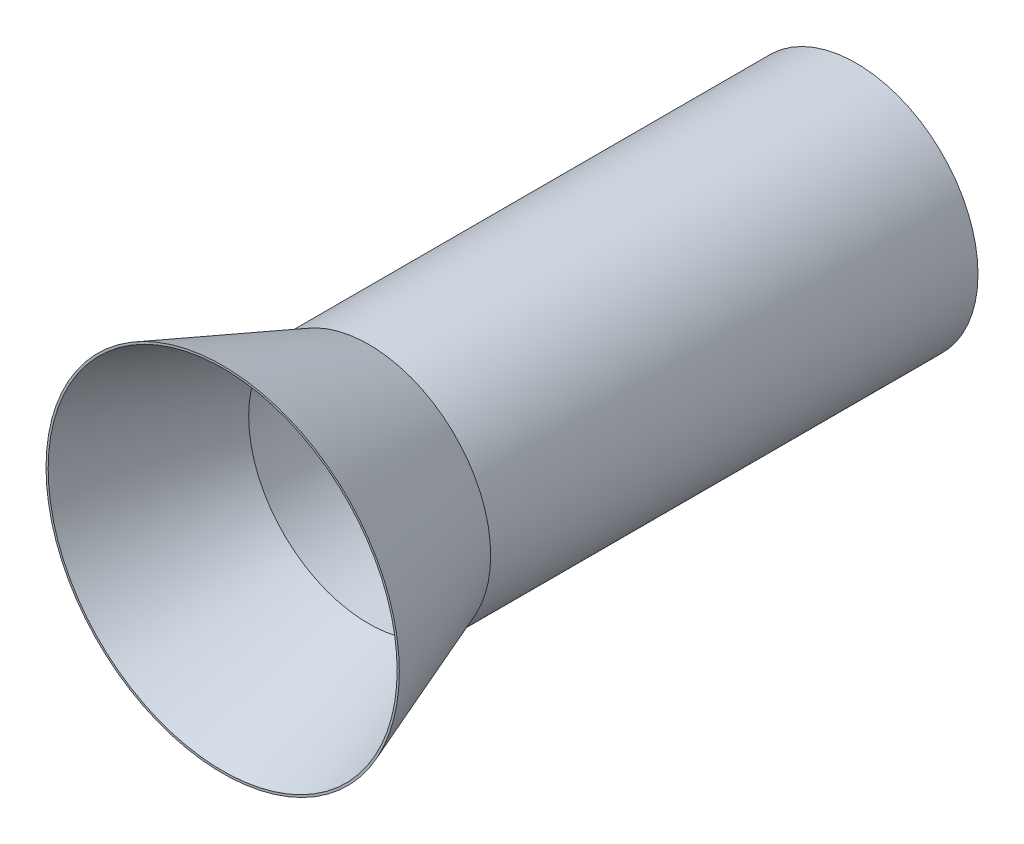
ISO-10303-21;
HEADER;
FILE_DESCRIPTION(('STEP AP214'),'2;1');
FILE_NAME('part.step','',(''),(''),'','','');
FILE_SCHEMA(('AUTOMOTIVE_DESIGN { 1 0 10303 214 1 1 1 1 }'));
ENDSEC;
DATA;
#1=APPLICATION_CONTEXT('core data for automotive mechanical design processes');
#2=APPLICATION_PROTOCOL_DEFINITION('international standard','automotive_design',2000,#1);
#3=PRODUCT_CONTEXT('',#1,'mechanical');
#4=PRODUCT('Part','Part','',(#3));
#5=PRODUCT_RELATED_PRODUCT_CATEGORY('part','',(#4));
#6=PRODUCT_DEFINITION_FORMATION('','',#4);
#7=PRODUCT_DEFINITION_CONTEXT('part definition',#1,'design');
#8=PRODUCT_DEFINITION('design','',#6,#7);
#9=PRODUCT_DEFINITION_SHAPE('','',#8);
#10=(LENGTH_UNIT() NAMED_UNIT(*) SI_UNIT(.MILLI.,.METRE.));
#11=(NAMED_UNIT(*) PLANE_ANGLE_UNIT() SI_UNIT($,.RADIAN.));
#12=(NAMED_UNIT(*) SI_UNIT($,.STERADIAN.) SOLID_ANGLE_UNIT());
#13=UNCERTAINTY_MEASURE_WITH_UNIT(LENGTH_MEASURE(1.E-05),#10,'distance_accuracy_value','');
#14=(GEOMETRIC_REPRESENTATION_CONTEXT(3) GLOBAL_UNCERTAINTY_ASSIGNED_CONTEXT((#13)) GLOBAL_UNIT_ASSIGNED_CONTEXT((#10,
#11,#12)) REPRESENTATION_CONTEXT('',''));
#15=CARTESIAN_POINT('',(0.,0.,0.));
#16=DIRECTION('',(0.,0.,1.));
#17=DIRECTION('',(1.,0.,0.));
#18=AXIS2_PLACEMENT_3D('',#15,#16,#17);
#19=CARTESIAN_POINT('',(-98.8450874332296,-2540.,2489.2));
#20=DIRECTION('',(0.,0.,1.));
#21=DIRECTION('',(1.,0.,0.));
#22=AXIS2_PLACEMENT_3D('',#19,#20,#21);
#23=CONICAL_SURFACE('',#22,272.834098552318,0.35877067029994);
#24=CARTESIAN_POINT('',(-98.8450874332296,-2540.,2261.17573721428));
#25=DIRECTION('',(0.,0.,-1.));
#26=DIRECTION('',(-1.,0.,0.));
#27=AXIS2_PLACEMENT_3D('',#24,#25,#26);
#28=CIRCLE('',#27,187.325);
#29=CARTESIAN_POINT('',(-286.17008743323,-2540.,2261.17573721428));
#30=VERTEX_POINT('',#29);
#31=EDGE_CURVE('E29',#30,#30,#28,.T.);
#32=ORIENTED_EDGE('',*,*,#31,.T.);
#33=EDGE_LOOP('',(#32));
#34=FACE_BOUND('',#33,.T.);
#35=CARTESIAN_POINT('',(-98.8450874332296,-2540.,2489.2));
#36=DIRECTION('',(0.,0.,1.));
#37=DIRECTION('',(1.,0.,0.));
#38=AXIS2_PLACEMENT_3D('',#35,#36,#37);
#39=CIRCLE('',#38,272.834098552318);
#40=CARTESIAN_POINT('',(173.989011119089,-2540.,2489.2));
#41=VERTEX_POINT('',#40);
#42=EDGE_CURVE('E17',#41,#41,#39,.F.);
#43=ORIENTED_EDGE('',*,*,#42,.F.);
#44=EDGE_LOOP('',(#43));
#45=FACE_BOUND('',#44,.T.);
#46=ADVANCED_FACE('F14',(#34,#45),#23,.F.);
#47=CARTESIAN_POINT('',(-98.8450874332296,-2540.,1498.6));
#48=DIRECTION('',(0.,0.,-1.));
#49=DIRECTION('',(-1.,0.,0.));
#50=AXIS2_PLACEMENT_3D('',#47,#48,#49);
#51=CYLINDRICAL_SURFACE('',#50,187.325);
#52=ORIENTED_EDGE('',*,*,#31,.F.);
#53=EDGE_LOOP('',(#52));
#54=FACE_BOUND('',#53,.T.);
#55=CARTESIAN_POINT('',(-98.8450874332296,-2540.,1498.6));
#56=DIRECTION('',(0.,0.,-1.));
#57=DIRECTION('',(-1.,0.,0.));
#58=AXIS2_PLACEMENT_3D('',#55,#56,#57);
#59=CIRCLE('',#58,187.325);
#60=CARTESIAN_POINT('',(-286.17008743323,-2540.,1498.6));
#61=VERTEX_POINT('',#60);
#62=EDGE_CURVE('E33',#61,#61,#59,.T.);
#63=ORIENTED_EDGE('',*,*,#62,.T.);
#64=EDGE_LOOP('',(#63));
#65=FACE_BOUND('',#64,.T.);
#66=ADVANCED_FACE('F44',(#54,#65),#51,.F.);
#67=CARTESIAN_POINT('',(-98.8450874332296,-2540.,2489.2));
#68=DIRECTION('',(0.,0.,1.));
#69=DIRECTION('',(1.,0.,0.));
#70=AXIS2_PLACEMENT_3D('',#67,#68,#69);
#71=PLANE('',#70);
#72=ORIENTED_EDGE('',*,*,#42,.T.);
#73=EDGE_LOOP('',(#72));
#74=FACE_BOUND('',#73,.T.);
#75=CARTESIAN_POINT('',(-98.8450874332296,-2540.,2489.19999999999));
#76=DIRECTION('',(0.,0.,1.));
#77=DIRECTION('',(1.,0.,0.));
#78=AXIS2_PLACEMENT_3D('',#75,#76,#77);
#79=CIRCLE('',#78,276.225000000039);
#80=CARTESIAN_POINT('',(177.379912566809,-2540.,2489.19999999999));
#81=VERTEX_POINT('',#80);
#82=EDGE_CURVE('E26',#81,#81,#79,.F.);
#83=ORIENTED_EDGE('',*,*,#82,.F.);
#84=EDGE_LOOP('',(#83));
#85=FACE_BOUND('',#84,.T.);
#86=ADVANCED_FACE('F40',(#74,#85),#71,.T.);
#87=CARTESIAN_POINT('',(-98.8450874332296,-2540.,1498.6));
#88=DIRECTION('',(0.,0.,1.));
#89=DIRECTION('',(1.,0.,0.));
#90=AXIS2_PLACEMENT_3D('',#87,#88,#89);
#91=PLANE('',#90);
#92=ORIENTED_EDGE('',*,*,#62,.F.);
#93=EDGE_LOOP('',(#92));
#94=FACE_BOUND('',#93,.T.);
#95=CARTESIAN_POINT('',(-98.8450874332296,-2540.,1498.6));
#96=DIRECTION('',(0.,0.,-1.));
#97=DIRECTION('',(-1.,0.,0.));
#98=AXIS2_PLACEMENT_3D('',#95,#96,#97);
#99=CIRCLE('',#98,190.5);
#100=CARTESIAN_POINT('',(-289.34508743323,-2540.,1498.6));
#101=VERTEX_POINT('',#100);
#102=EDGE_CURVE('E21',#101,#101,#99,.F.);
#103=ORIENTED_EDGE('',*,*,#102,.F.);
#104=EDGE_LOOP('',(#103));
#105=FACE_BOUND('',#104,.T.);
#106=ADVANCED_FACE('F59',(#94,#105),#91,.F.);
#107=CARTESIAN_POINT('',(-98.8450874332296,-2540.,2489.19999999999));
#108=DIRECTION('',(0.,0.,1.));
#109=DIRECTION('',(1.,0.,0.));
#110=AXIS2_PLACEMENT_3D('',#107,#108,#109);
#111=CONICAL_SURFACE('',#110,276.225000000039,0.35877067029994);
#112=CARTESIAN_POINT('',(-98.8450874332296,-2540.,2260.60000002057));
#113=DIRECTION('',(0.,0.,-1.));
#114=DIRECTION('',(-1.,0.,0.));
#115=AXIS2_PLACEMENT_3D('',#112,#113,#114);
#116=CIRCLE('',#115,190.5);
#117=CARTESIAN_POINT('',(-289.34508743323,-2540.,2260.60000002057));
#118=VERTEX_POINT('',#117);
#119=EDGE_CURVE('E10',#118,#118,#116,.T.);
#120=ORIENTED_EDGE('',*,*,#119,.F.);
#121=EDGE_LOOP('',(#120));
#122=FACE_BOUND('',#121,.T.);
#123=ORIENTED_EDGE('',*,*,#82,.T.);
#124=EDGE_LOOP('',(#123));
#125=FACE_BOUND('',#124,.T.);
#126=ADVANCED_FACE('F53',(#122,#125),#111,.T.);
#127=CARTESIAN_POINT('',(-98.8450874332296,-2540.,1498.6));
#128=DIRECTION('',(0.,0.,-1.));
#129=DIRECTION('',(-1.,0.,0.));
#130=AXIS2_PLACEMENT_3D('',#127,#128,#129);
#131=CYLINDRICAL_SURFACE('',#130,190.5);
#132=ORIENTED_EDGE('',*,*,#102,.T.);
#133=EDGE_LOOP('',(#132));
#134=FACE_BOUND('',#133,.T.);
#135=ORIENTED_EDGE('',*,*,#119,.T.);
#136=EDGE_LOOP('',(#135));
#137=FACE_BOUND('',#136,.T.);
#138=ADVANCED_FACE('F51',(#134,#137),#131,.T.);
#139=CLOSED_SHELL('',(#46,#66,#86,#106,#126,#138));
#140=MANIFOLD_SOLID_BREP('B1',#139);
#141=ADVANCED_BREP_SHAPE_REPRESENTATION('',(#18,#140),#14);
#142=SHAPE_DEFINITION_REPRESENTATION(#9,#141);
ENDSEC;
END-ISO-10303-21;
